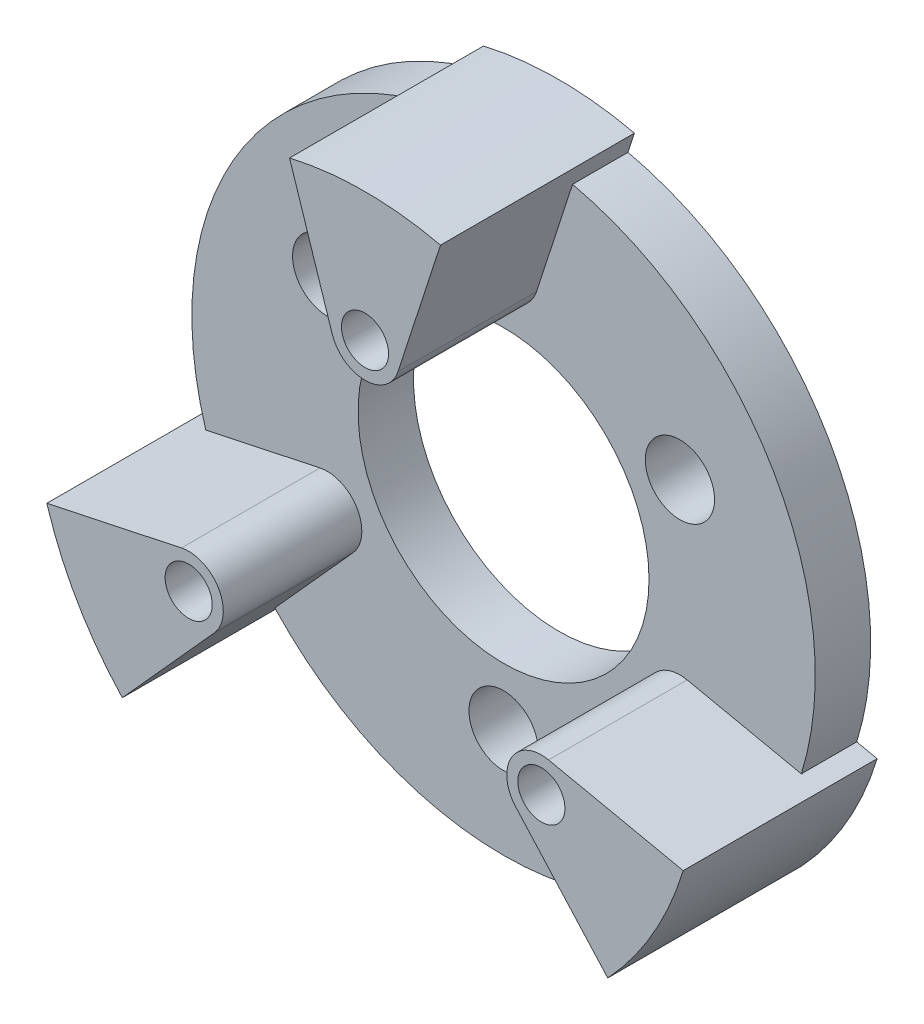
ISO-10303-21;
HEADER;
FILE_DESCRIPTION(('STEP AP214'),'2;1');
FILE_NAME('part.step','',(''),(''),'','','');
FILE_SCHEMA(('AUTOMOTIVE_DESIGN { 1 0 10303 214 1 1 1 1 }'));
ENDSEC;
DATA;
#1=APPLICATION_CONTEXT('core data for automotive mechanical design processes');
#2=APPLICATION_PROTOCOL_DEFINITION('international standard','automotive_design',2000,#1);
#3=PRODUCT_CONTEXT('',#1,'mechanical');
#4=PRODUCT('Part','Part','',(#3));
#5=PRODUCT_RELATED_PRODUCT_CATEGORY('part','',(#4));
#6=PRODUCT_DEFINITION_FORMATION('','',#4);
#7=PRODUCT_DEFINITION_CONTEXT('part definition',#1,'design');
#8=PRODUCT_DEFINITION('design','',#6,#7);
#9=PRODUCT_DEFINITION_SHAPE('','',#8);
#10=(LENGTH_UNIT() NAMED_UNIT(*) SI_UNIT(.MILLI.,.METRE.));
#11=(NAMED_UNIT(*) PLANE_ANGLE_UNIT() SI_UNIT($,.RADIAN.));
#12=(NAMED_UNIT(*) SI_UNIT($,.STERADIAN.) SOLID_ANGLE_UNIT());
#13=UNCERTAINTY_MEASURE_WITH_UNIT(LENGTH_MEASURE(1.E-05),#10,'distance_accuracy_value','');
#14=(GEOMETRIC_REPRESENTATION_CONTEXT(3) GLOBAL_UNCERTAINTY_ASSIGNED_CONTEXT((#13)) GLOBAL_UNIT_ASSIGNED_CONTEXT((#10,
#11,#12)) REPRESENTATION_CONTEXT('',''));
#15=CARTESIAN_POINT('',(0.,0.,0.));
#16=DIRECTION('',(0.,0.,1.));
#17=DIRECTION('',(1.,0.,0.));
#18=AXIS2_PLACEMENT_3D('',#15,#16,#17);
#19=CARTESIAN_POINT('',(0.,0.,14.));
#20=DIRECTION('',(0.,0.,1.));
#21=DIRECTION('',(1.,0.,0.));
#22=AXIS2_PLACEMENT_3D('',#19,#20,#21);
#23=PLANE('',#22);
#24=DIRECTION('',(-0.978147600733803,-0.20791169081777,0.));
#25=VECTOR('',#24,1.);
#26=CARTESIAN_POINT('',(0.424669986096791,-1.99791520318265,14.));
#27=LINE('',#26,#25);
#28=CARTESIAN_POINT('',(-13.2503526626756,-4.90463099816555,14.));
#29=VERTEX_POINT('',#28);
#30=CARTESIAN_POINT('',(-22.9657003966474,-6.96969190792735,14.));
#31=VERTEX_POINT('',#30);
#32=EDGE_CURVE('E216',#29,#31,#27,.T.);
#33=ORIENTED_EDGE('',*,*,#32,.T.);
#34=CARTESIAN_POINT('',(0.,0.,14.));
#35=DIRECTION('',(0.,0.,1.));
#36=DIRECTION('',(1.,0.,0.));
#37=AXIS2_PLACEMENT_3D('',#34,#35,#36);
#38=CIRCLE('',#37,24.);
#39=CARTESIAN_POINT('',(-17.5187804471395,-16.4040340052355,14.));
#40=VERTEX_POINT('',#39);
#41=EDGE_CURVE('E220',#31,#40,#38,.T.);
#42=ORIENTED_EDGE('',*,*,#41,.T.);
#43=DIRECTION('',(-0.669130606358859,-0.743144825477394,0.));
#44=VECTOR('',#43,1.);
#45=CARTESIAN_POINT('',(-1.51791032751495,1.36673259777592,14.));
#46=LINE('',#45,#44);
#47=CARTESIAN_POINT('',(-10.8727113719377,-9.02282651589721,14.));
#48=VERTEX_POINT('',#47);
#49=EDGE_CURVE('E225',#48,#40,#46,.T.);
#50=ORIENTED_EDGE('',*,*,#49,.F.);
#51=CARTESIAN_POINT('',(-12.7305734356312,-7.35000000000006,14.));
#52=DIRECTION('',(0.,0.,1.));
#53=DIRECTION('',(1.,0.,0.));
#54=AXIS2_PLACEMENT_3D('',#51,#52,#53);
#55=CIRCLE('',#54,2.5);
#56=EDGE_CURVE('E229',#48,#29,#55,.T.);
#57=ORIENTED_EDGE('',*,*,#56,.T.);
#58=EDGE_LOOP('',(#33,#42,#50,#57));
#59=FACE_BOUND('',#58,.T.);
#60=CARTESIAN_POINT('',(-12.7305734356312,-7.35000000000006,14.));
#61=DIRECTION('',(0.,0.,-1.));
#62=DIRECTION('',(-1.,0.,0.));
#63=AXIS2_PLACEMENT_3D('',#60,#61,#62);
#64=CIRCLE('',#63,1.7);
#65=CARTESIAN_POINT('',(-14.4305734356312,-7.35000000000006,14.));
#66=VERTEX_POINT('',#65);
#67=EDGE_CURVE('E506',#66,#66,#64,.T.);
#68=ORIENTED_EDGE('',*,*,#67,.T.);
#69=EDGE_LOOP('',(#68));
#70=FACE_BOUND('',#69,.T.);
#71=ADVANCED_FACE('F43',(#59,#70),#23,.T.);
#72=CARTESIAN_POINT('',(0.,0.,14.));
#73=DIRECTION('',(0.,0.,1.));
#74=DIRECTION('',(1.,0.,0.));
#75=AXIS2_PLACEMENT_3D('',#72,#73,#74);
#76=PLANE('',#75);
#77=DIRECTION('',(0.30901699437493,0.951056516295159,0.));
#78=VECTOR('',#77,1.);
#79=CARTESIAN_POINT('',(-1.94258031361156,0.631182605406652,14.));
#80=LINE('',#79,#78);
#81=CARTESIAN_POINT('',(2.37764129073789,13.9274575140627,14.));
#82=VERTEX_POINT('',#81);
#83=CARTESIAN_POINT('',(5.44691994950779,23.3737259131627,14.));
#84=VERTEX_POINT('',#83);
#85=EDGE_CURVE('E250',#82,#84,#80,.T.);
#86=ORIENTED_EDGE('',*,*,#85,.T.);
#87=CARTESIAN_POINT('',(0.,0.,14.));
#88=DIRECTION('',(0.,0.,1.));
#89=DIRECTION('',(1.,0.,0.));
#90=AXIS2_PLACEMENT_3D('',#87,#88,#89);
#91=CIRCLE('',#90,24.);
#92=CARTESIAN_POINT('',(-5.44691994950804,23.3737259131627,14.));
#93=VERTEX_POINT('',#92);
#94=EDGE_CURVE('E254',#84,#93,#91,.T.);
#95=ORIENTED_EDGE('',*,*,#94,.T.);
#96=DIRECTION('',(-0.309016994374954,0.951056516295151,0.));
#97=VECTOR('',#96,1.);
#98=CARTESIAN_POINT('',(1.94258031361188,0.631182605406812,14.));
#99=LINE('',#98,#97);
#100=CARTESIAN_POINT('',(-2.37764129073789,13.9274575140626,14.));
#101=VERTEX_POINT('',#100);
#102=EDGE_CURVE('E259',#101,#93,#99,.T.);
#103=ORIENTED_EDGE('',*,*,#102,.F.);
#104=CARTESIAN_POINT('',(0.,14.7,14.));
#105=DIRECTION('',(0.,0.,1.));
#106=DIRECTION('',(1.,0.,0.));
#107=AXIS2_PLACEMENT_3D('',#104,#105,#106);
#108=CIRCLE('',#107,2.5);
#109=EDGE_CURVE('E263',#101,#82,#108,.T.);
#110=ORIENTED_EDGE('',*,*,#109,.T.);
#111=EDGE_LOOP('',(#86,#95,#103,#110));
#112=FACE_BOUND('',#111,.T.);
#113=CARTESIAN_POINT('',(0.,14.7,14.));
#114=DIRECTION('',(0.,0.,-1.));
#115=DIRECTION('',(-1.,0.,0.));
#116=AXIS2_PLACEMENT_3D('',#113,#114,#115);
#117=CIRCLE('',#116,1.7);
#118=CARTESIAN_POINT('',(-1.7,14.7,14.));
#119=VERTEX_POINT('',#118);
#120=EDGE_CURVE('E520',#119,#119,#117,.T.);
#121=ORIENTED_EDGE('',*,*,#120,.T.);
#122=EDGE_LOOP('',(#121));
#123=FACE_BOUND('',#122,.T.);
#124=ADVANCED_FACE('F426',(#112,#123),#76,.T.);
#125=CARTESIAN_POINT('',(0.,0.,14.));
#126=DIRECTION('',(0.,0.,1.));
#127=DIRECTION('',(1.,0.,0.));
#128=AXIS2_PLACEMENT_3D('',#125,#126,#127);
#129=PLANE('',#128);
#130=DIRECTION('',(0.978147600733808,-0.207911690817746,0.));
#131=VECTOR('',#130,1.);
#132=CARTESIAN_POINT('',(-0.424669986096812,-1.99791520318299,14.));
#133=LINE('',#132,#131);
#134=CARTESIAN_POINT('',(13.2503526626756,-4.90463099816555,14.));
#135=VERTEX_POINT('',#134);
#136=CARTESIAN_POINT('',(22.9657003966475,-6.96969190792711,14.));
#137=VERTEX_POINT('',#136);
#138=EDGE_CURVE('E177',#135,#137,#133,.T.);
#139=ORIENTED_EDGE('',*,*,#138,.F.);
#140=CARTESIAN_POINT('',(12.7305734356312,-7.35000000000006,14.));
#141=DIRECTION('',(0.,0.,1.));
#142=DIRECTION('',(1.,0.,0.));
#143=AXIS2_PLACEMENT_3D('',#140,#141,#142);
#144=CIRCLE('',#143,2.5);
#145=CARTESIAN_POINT('',(10.8727113719377,-9.0228265158972,14.));
#146=VERTEX_POINT('',#145);
#147=EDGE_CURVE('E186',#135,#146,#144,.T.);
#148=ORIENTED_EDGE('',*,*,#147,.T.);
#149=DIRECTION('',(0.669130606358877,-0.743144825477377,0.));
#150=VECTOR('',#149,1.);
#151=CARTESIAN_POINT('',(1.51791032751466,1.36673259777573,14.));
#152=LINE('',#151,#150);
#153=CARTESIAN_POINT('',(17.5187804471396,-16.4040340052354,14.));
#154=VERTEX_POINT('',#153);
#155=EDGE_CURVE('E191',#146,#154,#152,.T.);
#156=ORIENTED_EDGE('',*,*,#155,.T.);
#157=CARTESIAN_POINT('',(0.,0.,14.));
#158=DIRECTION('',(0.,0.,1.));
#159=DIRECTION('',(1.,0.,0.));
#160=AXIS2_PLACEMENT_3D('',#157,#158,#159);
#161=CIRCLE('',#160,24.);
#162=EDGE_CURVE('E197',#154,#137,#161,.T.);
#163=ORIENTED_EDGE('',*,*,#162,.T.);
#164=EDGE_LOOP('',(#139,#148,#156,#163));
#165=FACE_BOUND('',#164,.T.);
#166=CARTESIAN_POINT('',(12.7305734356312,-7.35000000000006,14.));
#167=DIRECTION('',(0.,0.,-1.));
#168=DIRECTION('',(-1.,0.,0.));
#169=AXIS2_PLACEMENT_3D('',#166,#167,#168);
#170=CIRCLE('',#169,1.7);
#171=CARTESIAN_POINT('',(11.0305734356312,-7.35000000000006,14.));
#172=VERTEX_POINT('',#171);
#173=EDGE_CURVE('E532',#172,#172,#170,.T.);
#174=ORIENTED_EDGE('',*,*,#173,.T.);
#175=EDGE_LOOP('',(#174));
#176=FACE_BOUND('',#175,.T.);
#177=ADVANCED_FACE('F194',(#165,#176),#129,.T.);
#178=CARTESIAN_POINT('',(0.,0.,4.));
#179=DIRECTION('',(0.,0.,1.));
#180=DIRECTION('',(1.,0.,0.));
#181=AXIS2_PLACEMENT_3D('',#178,#179,#180);
#182=PLANE('',#181);
#183=CARTESIAN_POINT('',(0.,-14.7,4.));
#184=DIRECTION('',(0.,0.,1.));
#185=DIRECTION('',(1.,0.,0.));
#186=AXIS2_PLACEMENT_3D('',#183,#184,#185);
#187=CIRCLE('',#186,2.5);
#188=CARTESIAN_POINT('',(2.5,-14.7,4.));
#189=VERTEX_POINT('',#188);
#190=EDGE_CURVE('E203',#189,#189,#187,.T.);
#191=ORIENTED_EDGE('',*,*,#190,.F.);
#192=EDGE_LOOP('',(#191));
#193=FACE_BOUND('',#192,.T.);
#194=CARTESIAN_POINT('',(-12.7305734356312,7.35000000000006,4.));
#195=DIRECTION('',(0.,0.,1.));
#196=DIRECTION('',(1.,0.,0.));
#197=AXIS2_PLACEMENT_3D('',#194,#195,#196);
#198=CIRCLE('',#197,2.5);
#199=CARTESIAN_POINT('',(-10.2305734356312,7.35000000000006,4.));
#200=VERTEX_POINT('',#199);
#201=EDGE_CURVE('E551',#200,#200,#198,.T.);
#202=ORIENTED_EDGE('',*,*,#201,.F.);
#203=EDGE_LOOP('',(#202));
#204=FACE_BOUND('',#203,.T.);
#205=CARTESIAN_POINT('',(12.7305734356313,7.34999999999988,4.));
#206=DIRECTION('',(0.,0.,1.));
#207=DIRECTION('',(1.,0.,0.));
#208=AXIS2_PLACEMENT_3D('',#205,#206,#207);
#209=CIRCLE('',#208,2.5);
#210=CARTESIAN_POINT('',(15.2305734356313,7.34999999999988,4.));
#211=VERTEX_POINT('',#210);
#212=EDGE_CURVE('E541',#211,#211,#209,.T.);
#213=ORIENTED_EDGE('',*,*,#212,.F.);
#214=EDGE_LOOP('',(#213));
#215=FACE_BOUND('',#214,.T.);
#216=DIRECTION('',(0.978147600733808,-0.207911690817746,0.));
#217=VECTOR('',#216,1.);
#218=CARTESIAN_POINT('',(-0.424669986096812,-1.99791520318299,4.));
#219=LINE('',#218,#217);
#220=CARTESIAN_POINT('',(13.2503526626756,-4.90463099816555,4.));
#221=VERTEX_POINT('',#220);
#222=CARTESIAN_POINT('',(21.4927780589352,-6.65661260021603,4.));
#223=VERTEX_POINT('',#222);
#224=EDGE_CURVE('E178',#221,#223,#219,.T.);
#225=ORIENTED_EDGE('',*,*,#224,.T.);
#226=CARTESIAN_POINT('',(0.,0.,4.));
#227=DIRECTION('',(0.,0.,1.));
#228=DIRECTION('',(1.,0.,0.));
#229=AXIS2_PLACEMENT_3D('',#226,#227,#228);
#230=CIRCLE('',#229,22.5);
#231=CARTESIAN_POINT('',(4.98159341452872,21.9415980970467,4.));
#232=VERTEX_POINT('',#231);
#233=EDGE_CURVE('E53',#223,#232,#230,.T.);
#234=ORIENTED_EDGE('',*,*,#233,.T.);
#235=DIRECTION('',(0.30901699437493,0.951056516295159,0.));
#236=VECTOR('',#235,1.);
#237=CARTESIAN_POINT('',(-1.94258031361156,0.631182605406652,4.));
#238=LINE('',#237,#236);
#239=CARTESIAN_POINT('',(2.37764129073789,13.9274575140627,4.));
#240=VERTEX_POINT('',#239);
#241=EDGE_CURVE('E249',#240,#232,#238,.T.);
#242=ORIENTED_EDGE('',*,*,#241,.F.);
#243=CARTESIAN_POINT('',(0.,14.7,4.));
#244=DIRECTION('',(0.,0.,1.));
#245=DIRECTION('',(1.,0.,0.));
#246=AXIS2_PLACEMENT_3D('',#243,#244,#245);
#247=CIRCLE('',#246,2.5);
#248=CARTESIAN_POINT('',(-2.37764129073789,13.9274575140626,4.));
#249=VERTEX_POINT('',#248);
#250=EDGE_CURVE('E255',#249,#240,#247,.T.);
#251=ORIENTED_EDGE('',*,*,#250,.F.);
#252=DIRECTION('',(-0.309016994374954,0.951056516295151,0.));
#253=VECTOR('',#252,1.);
#254=CARTESIAN_POINT('',(1.94258031361188,0.631182605406812,4.));
#255=LINE('',#254,#253);
#256=CARTESIAN_POINT('',(-4.98159341452892,21.9415980970467,4.));
#257=VERTEX_POINT('',#256);
#258=EDGE_CURVE('E270',#249,#257,#255,.T.);
#259=ORIENTED_EDGE('',*,*,#258,.T.);
#260=CARTESIAN_POINT('',(-21.4927780589351,-6.65661260021624,4.));
#261=VERTEX_POINT('',#260);
#262=EDGE_CURVE('E55',#257,#261,#230,.T.);
#263=ORIENTED_EDGE('',*,*,#262,.T.);
#264=DIRECTION('',(-0.978147600733803,-0.20791169081777,0.));
#265=VECTOR('',#264,1.);
#266=CARTESIAN_POINT('',(0.424669986096791,-1.99791520318265,4.));
#267=LINE('',#266,#265);
#268=CARTESIAN_POINT('',(-13.2503526626756,-4.90463099816556,4.));
#269=VERTEX_POINT('',#268);
#270=EDGE_CURVE('E181',#269,#261,#267,.T.);
#271=ORIENTED_EDGE('',*,*,#270,.F.);
#272=CARTESIAN_POINT('',(-12.7305734356312,-7.35000000000006,4.));
#273=DIRECTION('',(0.,0.,1.));
#274=DIRECTION('',(1.,0.,0.));
#275=AXIS2_PLACEMENT_3D('',#272,#273,#274);
#276=CIRCLE('',#275,2.5);
#277=CARTESIAN_POINT('',(-10.8727113719377,-9.02282651589721,4.));
#278=VERTEX_POINT('',#277);
#279=EDGE_CURVE('E221',#278,#269,#276,.T.);
#280=ORIENTED_EDGE('',*,*,#279,.F.);
#281=DIRECTION('',(-0.669130606358859,-0.743144825477394,0.));
#282=VECTOR('',#281,1.);
#283=CARTESIAN_POINT('',(-1.51791032751495,1.36673259777592,4.));
#284=LINE('',#283,#282);
#285=CARTESIAN_POINT('',(-16.5111846444062,-15.2849854968307,4.));
#286=VERTEX_POINT('',#285);
#287=EDGE_CURVE('E236',#278,#286,#284,.T.);
#288=ORIENTED_EDGE('',*,*,#287,.T.);
#289=CARTESIAN_POINT('',(16.5111846444064,-15.2849854968305,4.));
#290=VERTEX_POINT('',#289);
#291=EDGE_CURVE('E11',#286,#290,#230,.T.);
#292=ORIENTED_EDGE('',*,*,#291,.T.);
#293=DIRECTION('',(0.669130606358877,-0.743144825477377,0.));
#294=VECTOR('',#293,1.);
#295=CARTESIAN_POINT('',(1.51791032751466,1.36673259777573,4.));
#296=LINE('',#295,#294);
#297=CARTESIAN_POINT('',(10.8727113719377,-9.0228265158972,4.));
#298=VERTEX_POINT('',#297);
#299=EDGE_CURVE('E66',#298,#290,#296,.T.);
#300=ORIENTED_EDGE('',*,*,#299,.F.);
#301=CARTESIAN_POINT('',(12.7305734356312,-7.35000000000006,4.));
#302=DIRECTION('',(0.,0.,1.));
#303=DIRECTION('',(1.,0.,0.));
#304=AXIS2_PLACEMENT_3D('',#301,#302,#303);
#305=CIRCLE('',#304,2.5);
#306=EDGE_CURVE('E62',#221,#298,#305,.T.);
#307=ORIENTED_EDGE('',*,*,#306,.F.);
#308=EDGE_LOOP('',(#225,#234,#242,#251,#259,#263,#271,#280,#288,#292,#300,#307));
#309=FACE_BOUND('',#308,.T.);
#310=CARTESIAN_POINT('',(0.,0.,4.));
#311=DIRECTION('',(0.,0.,1.));
#312=DIRECTION('',(1.,0.,0.));
#313=AXIS2_PLACEMENT_3D('',#310,#311,#312);
#314=CIRCLE('',#313,10.5);
#315=CARTESIAN_POINT('',(10.5,0.,4.));
#316=VERTEX_POINT('',#315);
#317=EDGE_CURVE('E356',#316,#316,#314,.T.);
#318=ORIENTED_EDGE('',*,*,#317,.F.);
#319=EDGE_LOOP('',(#318));
#320=FACE_BOUND('',#319,.T.);
#321=ADVANCED_FACE('F393',(#193,#204,#215,#309,#320),#182,.T.);
#322=CARTESIAN_POINT('',(0.,0.,4.));
#323=DIRECTION('',(0.,0.,-1.));
#324=DIRECTION('',(-1.,0.,0.));
#325=AXIS2_PLACEMENT_3D('',#322,#323,#324);
#326=CYLINDRICAL_SURFACE('',#325,22.5);
#327=ORIENTED_EDGE('',*,*,#233,.F.);
#328=DIRECTION('',(0.,0.,-1.));
#329=VECTOR('',#328,1.);
#330=CARTESIAN_POINT('',(21.4927780589352,-6.65661260021603,4.));
#331=LINE('',#330,#329);
#332=CARTESIAN_POINT('',(21.4927780589352,-6.65661260021603,0.));
#333=VERTEX_POINT('',#332);
#334=EDGE_CURVE('E303',#223,#333,#331,.T.);
#335=ORIENTED_EDGE('',*,*,#334,.T.);
#336=CARTESIAN_POINT('',(0.,0.,0.));
#337=DIRECTION('',(0.,0.,1.));
#338=DIRECTION('',(1.,0.,0.));
#339=AXIS2_PLACEMENT_3D('',#336,#337,#338);
#340=CIRCLE('',#339,22.5);
#341=CARTESIAN_POINT('',(4.98159341452872,21.9415980970467,0.));
#342=VERTEX_POINT('',#341);
#343=EDGE_CURVE('E365',#333,#342,#340,.T.);
#344=ORIENTED_EDGE('',*,*,#343,.T.);
#345=DIRECTION('',(0.,0.,-1.));
#346=VECTOR('',#345,1.);
#347=CARTESIAN_POINT('',(4.98159341452872,21.9415980970467,4.));
#348=LINE('',#347,#346);
#349=EDGE_CURVE('E311',#342,#232,#348,.F.);
#350=ORIENTED_EDGE('',*,*,#349,.T.);
#351=EDGE_LOOP('',(#327,#335,#344,#350));
#352=FACE_BOUND('',#351,.T.);
#353=ADVANCED_FACE('F388',(#352),#326,.T.);
#354=ORIENTED_EDGE('',*,*,#262,.F.);
#355=DIRECTION('',(0.,0.,-1.));
#356=VECTOR('',#355,1.);
#357=CARTESIAN_POINT('',(-4.98159341452892,21.9415980970467,4.));
#358=LINE('',#357,#356);
#359=CARTESIAN_POINT('',(-4.98159341452892,21.9415980970467,0.));
#360=VERTEX_POINT('',#359);
#361=EDGE_CURVE('E327',#257,#360,#358,.T.);
#362=ORIENTED_EDGE('',*,*,#361,.T.);
#363=CARTESIAN_POINT('',(-21.4927780589351,-6.65661260021624,0.));
#364=VERTEX_POINT('',#363);
#365=EDGE_CURVE('E361',#360,#364,#340,.T.);
#366=ORIENTED_EDGE('',*,*,#365,.T.);
#367=DIRECTION('',(0.,0.,-1.));
#368=VECTOR('',#367,1.);
#369=CARTESIAN_POINT('',(-21.4927780589351,-6.65661260021623,4.));
#370=LINE('',#369,#368);
#371=EDGE_CURVE('E335',#364,#261,#370,.F.);
#372=ORIENTED_EDGE('',*,*,#371,.T.);
#373=EDGE_LOOP('',(#354,#362,#366,#372));
#374=FACE_BOUND('',#373,.T.);
#375=ADVANCED_FACE('F396',(#374),#326,.T.);
#376=CARTESIAN_POINT('',(0.,0.,4.));
#377=DIRECTION('',(0.,0.,-1.));
#378=DIRECTION('',(-1.,0.,0.));
#379=AXIS2_PLACEMENT_3D('',#376,#377,#378);
#380=CYLINDRICAL_SURFACE('',#379,10.5);
#381=ORIENTED_EDGE('',*,*,#317,.T.);
#382=EDGE_LOOP('',(#381));
#383=FACE_BOUND('',#382,.T.);
#384=CARTESIAN_POINT('',(0.,0.,0.));
#385=DIRECTION('',(0.,0.,1.));
#386=DIRECTION('',(1.,0.,0.));
#387=AXIS2_PLACEMENT_3D('',#384,#385,#386);
#388=CIRCLE('',#387,10.5);
#389=CARTESIAN_POINT('',(10.5,0.,0.));
#390=VERTEX_POINT('',#389);
#391=EDGE_CURVE('E355',#390,#390,#388,.T.);
#392=ORIENTED_EDGE('',*,*,#391,.F.);
#393=EDGE_LOOP('',(#392));
#394=FACE_BOUND('',#393,.T.);
#395=ADVANCED_FACE('F45',(#383,#394),#380,.F.);
#396=CARTESIAN_POINT('',(-16.5111846444062,-15.2849854968307,0.));
#397=VERTEX_POINT('',#396);
#398=CARTESIAN_POINT('',(16.5111846444064,-15.2849854968305,0.));
#399=VERTEX_POINT('',#398);
#400=EDGE_CURVE('E47',#397,#399,#340,.T.);
#401=ORIENTED_EDGE('',*,*,#400,.T.);
#402=DIRECTION('',(0.,0.,-1.));
#403=VECTOR('',#402,1.);
#404=CARTESIAN_POINT('',(16.5111846444064,-15.2849854968305,4.));
#405=LINE('',#404,#403);
#406=EDGE_CURVE('E288',#399,#290,#405,.F.);
#407=ORIENTED_EDGE('',*,*,#406,.T.);
#408=ORIENTED_EDGE('',*,*,#291,.F.);
#409=DIRECTION('',(0.,0.,-1.));
#410=VECTOR('',#409,1.);
#411=CARTESIAN_POINT('',(-16.5111846444062,-15.2849854968307,4.));
#412=LINE('',#411,#410);
#413=EDGE_CURVE('E351',#286,#397,#412,.T.);
#414=ORIENTED_EDGE('',*,*,#413,.T.);
#415=EDGE_LOOP('',(#401,#407,#408,#414));
#416=FACE_BOUND('',#415,.T.);
#417=ADVANCED_FACE('F372',(#416),#326,.T.);
#418=CARTESIAN_POINT('',(0.,0.,0.));
#419=DIRECTION('',(0.,0.,1.));
#420=DIRECTION('',(1.,0.,0.));
#421=AXIS2_PLACEMENT_3D('',#418,#419,#420);
#422=PLANE('',#421);
#423=CARTESIAN_POINT('',(-12.7305734356312,-7.35000000000006,0.));
#424=DIRECTION('',(0.,0.,-1.));
#425=DIRECTION('',(-1.,0.,0.));
#426=AXIS2_PLACEMENT_3D('',#423,#424,#425);
#427=CIRCLE('',#426,3.15);
#428=CARTESIAN_POINT('',(-15.8805734356312,-7.35000000000006,0.));
#429=VERTEX_POINT('',#428);
#430=EDGE_CURVE('E501',#429,#429,#427,.T.);
#431=ORIENTED_EDGE('',*,*,#430,.F.);
#432=EDGE_LOOP('',(#431));
#433=FACE_BOUND('',#432,.T.);
#434=CARTESIAN_POINT('',(0.,14.7,0.));
#435=DIRECTION('',(0.,0.,-1.));
#436=DIRECTION('',(-1.,0.,0.));
#437=AXIS2_PLACEMENT_3D('',#434,#435,#436);
#438=CIRCLE('',#437,3.15);
#439=CARTESIAN_POINT('',(-3.15,14.7,0.));
#440=VERTEX_POINT('',#439);
#441=EDGE_CURVE('E512',#440,#440,#438,.T.);
#442=ORIENTED_EDGE('',*,*,#441,.F.);
#443=EDGE_LOOP('',(#442));
#444=FACE_BOUND('',#443,.T.);
#445=CARTESIAN_POINT('',(12.7305734356312,-7.35000000000006,0.));
#446=DIRECTION('',(0.,0.,-1.));
#447=DIRECTION('',(-1.,0.,0.));
#448=AXIS2_PLACEMENT_3D('',#445,#446,#447);
#449=CIRCLE('',#448,3.15);
#450=CARTESIAN_POINT('',(9.58057343563122,-7.35000000000006,0.));
#451=VERTEX_POINT('',#450);
#452=EDGE_CURVE('E524',#451,#451,#449,.T.);
#453=ORIENTED_EDGE('',*,*,#452,.F.);
#454=EDGE_LOOP('',(#453));
#455=FACE_BOUND('',#454,.T.);
#456=CARTESIAN_POINT('',(0.,-14.7,0.));
#457=DIRECTION('',(0.,0.,1.));
#458=DIRECTION('',(1.,0.,0.));
#459=AXIS2_PLACEMENT_3D('',#456,#457,#458);
#460=CIRCLE('',#459,2.5);
#461=CARTESIAN_POINT('',(2.5,-14.7,0.));
#462=VERTEX_POINT('',#461);
#463=EDGE_CURVE('E537',#462,#462,#460,.T.);
#464=ORIENTED_EDGE('',*,*,#463,.T.);
#465=EDGE_LOOP('',(#464));
#466=FACE_BOUND('',#465,.T.);
#467=CARTESIAN_POINT('',(-12.7305734356312,7.35000000000006,0.));
#468=DIRECTION('',(0.,0.,1.));
#469=DIRECTION('',(1.,0.,0.));
#470=AXIS2_PLACEMENT_3D('',#467,#468,#469);
#471=CIRCLE('',#470,2.5);
#472=CARTESIAN_POINT('',(-10.2305734356312,7.35000000000006,0.));
#473=VERTEX_POINT('',#472);
#474=EDGE_CURVE('E542',#473,#473,#471,.T.);
#475=ORIENTED_EDGE('',*,*,#474,.T.);
#476=EDGE_LOOP('',(#475));
#477=FACE_BOUND('',#476,.T.);
#478=CARTESIAN_POINT('',(12.7305734356313,7.34999999999988,0.));
#479=DIRECTION('',(0.,0.,1.));
#480=DIRECTION('',(1.,0.,0.));
#481=AXIS2_PLACEMENT_3D('',#478,#479,#480);
#482=CIRCLE('',#481,2.5);
#483=CARTESIAN_POINT('',(15.2305734356313,7.34999999999988,0.));
#484=VERTEX_POINT('',#483);
#485=EDGE_CURVE('E536',#484,#484,#482,.T.);
#486=ORIENTED_EDGE('',*,*,#485,.T.);
#487=EDGE_LOOP('',(#486));
#488=FACE_BOUND('',#487,.T.);
#489=ORIENTED_EDGE('',*,*,#391,.T.);
#490=EDGE_LOOP('',(#489));
#491=FACE_BOUND('',#490,.T.);
#492=ORIENTED_EDGE('',*,*,#343,.F.);
#493=DIRECTION('',(0.978147600733809,-0.207911690817746,0.));
#494=VECTOR('',#493,1.);
#495=CARTESIAN_POINT('',(13.2503526626756,-4.90463099816555,0.));
#496=LINE('',#495,#494);
#497=CARTESIAN_POINT('',(22.9657003966475,-6.96969190792711,0.));
#498=VERTEX_POINT('',#497);
#499=EDGE_CURVE('E285',#333,#498,#496,.T.);
#500=ORIENTED_EDGE('',*,*,#499,.T.);
#501=CARTESIAN_POINT('',(0.,0.,0.));
#502=DIRECTION('',(0.,0.,1.));
#503=DIRECTION('',(1.,0.,0.));
#504=AXIS2_PLACEMENT_3D('',#501,#502,#503);
#505=CIRCLE('',#504,24.);
#506=CARTESIAN_POINT('',(17.5187804471397,-16.4040340052354,0.));
#507=VERTEX_POINT('',#506);
#508=EDGE_CURVE('E289',#498,#507,#505,.F.);
#509=ORIENTED_EDGE('',*,*,#508,.T.);
#510=DIRECTION('',(-0.669130606358877,0.743144825477377,0.));
#511=VECTOR('',#510,1.);
#512=CARTESIAN_POINT('',(10.8727113719377,-9.0228265158972,0.));
#513=LINE('',#512,#511);
#514=EDGE_CURVE('E290',#507,#399,#513,.T.);
#515=ORIENTED_EDGE('',*,*,#514,.T.);
#516=ORIENTED_EDGE('',*,*,#400,.F.);
#517=DIRECTION('',(-0.669130606358859,-0.743144825477394,0.));
#518=VECTOR('',#517,1.);
#519=CARTESIAN_POINT('',(-10.8727113719377,-9.02282651589721,0.));
#520=LINE('',#519,#518);
#521=CARTESIAN_POINT('',(-17.5187804471395,-16.4040340052355,0.));
#522=VERTEX_POINT('',#521);
#523=EDGE_CURVE('E332',#397,#522,#520,.T.);
#524=ORIENTED_EDGE('',*,*,#523,.T.);
#525=CARTESIAN_POINT('',(0.,0.,0.));
#526=DIRECTION('',(0.,0.,1.));
#527=DIRECTION('',(1.,0.,0.));
#528=AXIS2_PLACEMENT_3D('',#525,#526,#527);
#529=CIRCLE('',#528,24.);
#530=CARTESIAN_POINT('',(-22.9657003966474,-6.96969190792735,0.));
#531=VERTEX_POINT('',#530);
#532=EDGE_CURVE('E336',#522,#531,#529,.F.);
#533=ORIENTED_EDGE('',*,*,#532,.T.);
#534=DIRECTION('',(0.978147600733803,0.20791169081777,0.));
#535=VECTOR('',#534,1.);
#536=CARTESIAN_POINT('',(-13.2503526626756,-4.90463099816556,0.));
#537=LINE('',#536,#535);
#538=EDGE_CURVE('E337',#531,#364,#537,.T.);
#539=ORIENTED_EDGE('',*,*,#538,.T.);
#540=ORIENTED_EDGE('',*,*,#365,.F.);
#541=DIRECTION('',(-0.309016994374954,0.951056516295151,0.));
#542=VECTOR('',#541,1.);
#543=CARTESIAN_POINT('',(-2.37764129073789,13.9274575140626,0.));
#544=LINE('',#543,#542);
#545=CARTESIAN_POINT('',(-5.44691994950804,23.3737259131627,0.));
#546=VERTEX_POINT('',#545);
#547=EDGE_CURVE('E308',#360,#546,#544,.T.);
#548=ORIENTED_EDGE('',*,*,#547,.T.);
#549=CARTESIAN_POINT('',(0.,0.,0.));
#550=DIRECTION('',(0.,0.,1.));
#551=DIRECTION('',(1.,0.,0.));
#552=AXIS2_PLACEMENT_3D('',#549,#550,#551);
#553=CIRCLE('',#552,24.);
#554=CARTESIAN_POINT('',(5.44691994950779,23.3737259131627,0.));
#555=VERTEX_POINT('',#554);
#556=EDGE_CURVE('E312',#546,#555,#553,.F.);
#557=ORIENTED_EDGE('',*,*,#556,.T.);
#558=DIRECTION('',(-0.30901699437493,-0.951056516295159,0.));
#559=VECTOR('',#558,1.);
#560=CARTESIAN_POINT('',(2.37764129073789,13.9274575140627,0.));
#561=LINE('',#560,#559);
#562=EDGE_CURVE('E313',#555,#342,#561,.T.);
#563=ORIENTED_EDGE('',*,*,#562,.T.);
#564=EDGE_LOOP('',(#492,#500,#509,#515,#516,#524,#533,#539,#540,#548,#557,#563));
#565=FACE_BOUND('',#564,.T.);
#566=ADVANCED_FACE('F381',(#433,#444,#455,#466,#477,#488,#491,#565),#422,.F.);
#567=CARTESIAN_POINT('',(-10.8727113719377,-9.02282651589721,-17.1953237976881));
#568=DIRECTION('',(0.743144825477394,-0.669130606358859,0.));
#569=DIRECTION('',(0.669130606358859,0.743144825477394,0.));
#570=AXIS2_PLACEMENT_3D('',#567,#568,#569);
#571=PLANE('',#570);
#572=ORIENTED_EDGE('',*,*,#413,.F.);
#573=ORIENTED_EDGE('',*,*,#287,.F.);
#574=DIRECTION('',(0.,0.,-1.));
#575=VECTOR('',#574,1.);
#576=CARTESIAN_POINT('',(-10.8727113719377,-9.02282651589721,14.));
#577=LINE('',#576,#575);
#578=EDGE_CURVE('E245',#48,#278,#577,.T.);
#579=ORIENTED_EDGE('',*,*,#578,.F.);
#580=ORIENTED_EDGE('',*,*,#49,.T.);
#581=DIRECTION('',(0.,0.,1.));
#582=VECTOR('',#581,1.);
#583=CARTESIAN_POINT('',(-17.5187804471395,-16.4040340052355,-17.1953237976881));
#584=LINE('',#583,#582);
#585=EDGE_CURVE('E331',#522,#40,#584,.T.);
#586=ORIENTED_EDGE('',*,*,#585,.F.);
#587=ORIENTED_EDGE('',*,*,#523,.F.);
#588=EDGE_LOOP('',(#572,#573,#579,#580,#586,#587));
#589=FACE_BOUND('',#588,.T.);
#590=ADVANCED_FACE('F408',(#589),#571,.T.);
#591=CARTESIAN_POINT('',(-13.2503526626756,-4.90463099816556,-17.1953237976881));
#592=DIRECTION('',(-0.20791169081777,0.978147600733803,0.));
#593=DIRECTION('',(-0.978147600733803,-0.20791169081777,0.));
#594=AXIS2_PLACEMENT_3D('',#591,#592,#593);
#595=PLANE('',#594);
#596=ORIENTED_EDGE('',*,*,#371,.F.);
#597=ORIENTED_EDGE('',*,*,#538,.F.);
#598=DIRECTION('',(0.,0.,1.));
#599=VECTOR('',#598,1.);
#600=CARTESIAN_POINT('',(-22.9657003966474,-6.96969190792735,-17.1953237976881));
#601=LINE('',#600,#599);
#602=EDGE_CURVE('E341',#531,#31,#601,.T.);
#603=ORIENTED_EDGE('',*,*,#602,.T.);
#604=ORIENTED_EDGE('',*,*,#32,.F.);
#605=DIRECTION('',(0.,0.,-1.));
#606=VECTOR('',#605,1.);
#607=CARTESIAN_POINT('',(-13.2503526626756,-4.90463099816555,14.));
#608=LINE('',#607,#606);
#609=EDGE_CURVE('E232',#29,#269,#608,.T.);
#610=ORIENTED_EDGE('',*,*,#609,.T.);
#611=ORIENTED_EDGE('',*,*,#270,.T.);
#612=EDGE_LOOP('',(#596,#597,#603,#604,#610,#611));
#613=FACE_BOUND('',#612,.T.);
#614=ADVANCED_FACE('F399',(#613),#595,.T.);
#615=CARTESIAN_POINT('',(0.,0.,-17.1953237976881));
#616=DIRECTION('',(0.,0.,1.));
#617=DIRECTION('',(1.,0.,0.));
#618=AXIS2_PLACEMENT_3D('',#615,#616,#617);
#619=CYLINDRICAL_SURFACE('',#618,24.);
#620=ORIENTED_EDGE('',*,*,#532,.F.);
#621=ORIENTED_EDGE('',*,*,#585,.T.);
#622=ORIENTED_EDGE('',*,*,#41,.F.);
#623=ORIENTED_EDGE('',*,*,#602,.F.);
#624=EDGE_LOOP('',(#620,#621,#622,#623));
#625=FACE_BOUND('',#624,.T.);
#626=ADVANCED_FACE('F413',(#625),#619,.T.);
#627=CARTESIAN_POINT('',(-2.37764129073789,13.9274575140626,-17.1953237976881));
#628=DIRECTION('',(-0.951056516295151,-0.309016994374954,0.));
#629=DIRECTION('',(0.309016994374954,-0.951056516295151,0.));
#630=AXIS2_PLACEMENT_3D('',#627,#628,#629);
#631=PLANE('',#630);
#632=ORIENTED_EDGE('',*,*,#361,.F.);
#633=ORIENTED_EDGE('',*,*,#258,.F.);
#634=DIRECTION('',(0.,0.,-1.));
#635=VECTOR('',#634,1.);
#636=CARTESIAN_POINT('',(-2.37764129073789,13.9274575140626,14.));
#637=LINE('',#636,#635);
#638=EDGE_CURVE('E280',#101,#249,#637,.T.);
#639=ORIENTED_EDGE('',*,*,#638,.F.);
#640=ORIENTED_EDGE('',*,*,#102,.T.);
#641=DIRECTION('',(0.,0.,1.));
#642=VECTOR('',#641,1.);
#643=CARTESIAN_POINT('',(-5.44691994950804,23.3737259131627,-17.1953237976881));
#644=LINE('',#643,#642);
#645=EDGE_CURVE('E307',#546,#93,#644,.T.);
#646=ORIENTED_EDGE('',*,*,#645,.F.);
#647=ORIENTED_EDGE('',*,*,#547,.F.);
#648=EDGE_LOOP('',(#632,#633,#639,#640,#646,#647));
#649=FACE_BOUND('',#648,.T.);
#650=ADVANCED_FACE('F419',(#649),#631,.T.);
#651=CARTESIAN_POINT('',(2.37764129073789,13.9274575140627,-17.1953237976881));
#652=DIRECTION('',(0.951056516295159,-0.30901699437493,0.));
#653=DIRECTION('',(0.30901699437493,0.951056516295159,0.));
#654=AXIS2_PLACEMENT_3D('',#651,#652,#653);
#655=PLANE('',#654);
#656=ORIENTED_EDGE('',*,*,#349,.F.);
#657=ORIENTED_EDGE('',*,*,#562,.F.);
#658=DIRECTION('',(0.,0.,1.));
#659=VECTOR('',#658,1.);
#660=CARTESIAN_POINT('',(5.44691994950779,23.3737259131627,-17.1953237976881));
#661=LINE('',#660,#659);
#662=EDGE_CURVE('E317',#555,#84,#661,.T.);
#663=ORIENTED_EDGE('',*,*,#662,.T.);
#664=ORIENTED_EDGE('',*,*,#85,.F.);
#665=DIRECTION('',(0.,0.,-1.));
#666=VECTOR('',#665,1.);
#667=CARTESIAN_POINT('',(2.37764129073789,13.9274575140627,14.));
#668=LINE('',#667,#666);
#669=EDGE_CURVE('E266',#82,#240,#668,.T.);
#670=ORIENTED_EDGE('',*,*,#669,.T.);
#671=ORIENTED_EDGE('',*,*,#241,.T.);
#672=EDGE_LOOP('',(#656,#657,#663,#664,#670,#671));
#673=FACE_BOUND('',#672,.T.);
#674=ADVANCED_FACE('F432',(#673),#655,.T.);
#675=CARTESIAN_POINT('',(0.,0.,-17.1953237976881));
#676=DIRECTION('',(0.,0.,1.));
#677=DIRECTION('',(1.,0.,0.));
#678=AXIS2_PLACEMENT_3D('',#675,#676,#677);
#679=CYLINDRICAL_SURFACE('',#678,24.);
#680=ORIENTED_EDGE('',*,*,#556,.F.);
#681=ORIENTED_EDGE('',*,*,#645,.T.);
#682=ORIENTED_EDGE('',*,*,#94,.F.);
#683=ORIENTED_EDGE('',*,*,#662,.F.);
#684=EDGE_LOOP('',(#680,#681,#682,#683));
#685=FACE_BOUND('',#684,.T.);
#686=ADVANCED_FACE('F423',(#685),#679,.T.);
#687=CARTESIAN_POINT('',(13.2503526626756,-4.90463099816555,-17.1953237976881));
#688=DIRECTION('',(0.207911690817746,0.978147600733808,0.));
#689=DIRECTION('',(-0.978147600733809,0.207911690817746,0.));
#690=AXIS2_PLACEMENT_3D('',#687,#688,#689);
#691=PLANE('',#690);
#692=ORIENTED_EDGE('',*,*,#334,.F.);
#693=ORIENTED_EDGE('',*,*,#224,.F.);
#694=DIRECTION('',(0.,0.,-1.));
#695=VECTOR('',#694,1.);
#696=CARTESIAN_POINT('',(13.2503526626756,-4.90463099816555,14.));
#697=LINE('',#696,#695);
#698=EDGE_CURVE('E171',#135,#221,#697,.T.);
#699=ORIENTED_EDGE('',*,*,#698,.F.);
#700=ORIENTED_EDGE('',*,*,#138,.T.);
#701=DIRECTION('',(0.,0.,1.));
#702=VECTOR('',#701,1.);
#703=CARTESIAN_POINT('',(22.9657003966475,-6.96969190792711,-17.1953237976881));
#704=LINE('',#703,#702);
#705=EDGE_CURVE('E284',#498,#137,#704,.T.);
#706=ORIENTED_EDGE('',*,*,#705,.F.);
#707=ORIENTED_EDGE('',*,*,#499,.F.);
#708=EDGE_LOOP('',(#692,#693,#699,#700,#706,#707));
#709=FACE_BOUND('',#708,.T.);
#710=ADVANCED_FACE('F174',(#709),#691,.T.);
#711=CARTESIAN_POINT('',(10.8727113719377,-9.0228265158972,-17.1953237976881));
#712=DIRECTION('',(-0.743144825477377,-0.669130606358877,0.));
#713=DIRECTION('',(0.669130606358877,-0.743144825477377,0.));
#714=AXIS2_PLACEMENT_3D('',#711,#712,#713);
#715=PLANE('',#714);
#716=ORIENTED_EDGE('',*,*,#406,.F.);
#717=ORIENTED_EDGE('',*,*,#514,.F.);
#718=DIRECTION('',(0.,0.,1.));
#719=VECTOR('',#718,1.);
#720=CARTESIAN_POINT('',(17.5187804471396,-16.4040340052354,-17.1953237976881));
#721=LINE('',#720,#719);
#722=EDGE_CURVE('E294',#507,#154,#721,.T.);
#723=ORIENTED_EDGE('',*,*,#722,.T.);
#724=ORIENTED_EDGE('',*,*,#155,.F.);
#725=DIRECTION('',(0.,0.,-1.));
#726=VECTOR('',#725,1.);
#727=CARTESIAN_POINT('',(10.8727113719377,-9.0228265158972,14.));
#728=LINE('',#727,#726);
#729=EDGE_CURVE('E182',#146,#298,#728,.T.);
#730=ORIENTED_EDGE('',*,*,#729,.T.);
#731=ORIENTED_EDGE('',*,*,#299,.T.);
#732=EDGE_LOOP('',(#716,#717,#723,#724,#730,#731));
#733=FACE_BOUND('',#732,.T.);
#734=ADVANCED_FACE('F379',(#733),#715,.T.);
#735=CARTESIAN_POINT('',(0.,0.,-17.1953237976881));
#736=DIRECTION('',(0.,0.,1.));
#737=DIRECTION('',(1.,0.,0.));
#738=AXIS2_PLACEMENT_3D('',#735,#736,#737);
#739=CYLINDRICAL_SURFACE('',#738,24.);
#740=ORIENTED_EDGE('',*,*,#508,.F.);
#741=ORIENTED_EDGE('',*,*,#705,.T.);
#742=ORIENTED_EDGE('',*,*,#162,.F.);
#743=ORIENTED_EDGE('',*,*,#722,.F.);
#744=EDGE_LOOP('',(#740,#741,#742,#743));
#745=FACE_BOUND('',#744,.T.);
#746=ADVANCED_FACE('F385',(#745),#739,.T.);
#747=CARTESIAN_POINT('',(0.,14.7,14.));
#748=DIRECTION('',(0.,0.,-1.));
#749=DIRECTION('',(-1.,0.,0.));
#750=AXIS2_PLACEMENT_3D('',#747,#748,#749);
#751=CYLINDRICAL_SURFACE('',#750,2.5);
#752=ORIENTED_EDGE('',*,*,#250,.T.);
#753=ORIENTED_EDGE('',*,*,#669,.F.);
#754=ORIENTED_EDGE('',*,*,#109,.F.);
#755=ORIENTED_EDGE('',*,*,#638,.T.);
#756=EDGE_LOOP('',(#752,#753,#754,#755));
#757=FACE_BOUND('',#756,.T.);
#758=ADVANCED_FACE('F435',(#757),#751,.T.);
#759=CARTESIAN_POINT('',(-12.7305734356312,-7.35000000000006,14.));
#760=DIRECTION('',(0.,0.,-1.));
#761=DIRECTION('',(-1.,0.,0.));
#762=AXIS2_PLACEMENT_3D('',#759,#760,#761);
#763=CYLINDRICAL_SURFACE('',#762,2.5);
#764=ORIENTED_EDGE('',*,*,#279,.T.);
#765=ORIENTED_EDGE('',*,*,#609,.F.);
#766=ORIENTED_EDGE('',*,*,#56,.F.);
#767=ORIENTED_EDGE('',*,*,#578,.T.);
#768=EDGE_LOOP('',(#764,#765,#766,#767));
#769=FACE_BOUND('',#768,.T.);
#770=ADVANCED_FACE('F404',(#769),#763,.T.);
#771=CARTESIAN_POINT('',(12.7305734356312,-7.35000000000006,14.));
#772=DIRECTION('',(0.,0.,-1.));
#773=DIRECTION('',(-1.,0.,0.));
#774=AXIS2_PLACEMENT_3D('',#771,#772,#773);
#775=CYLINDRICAL_SURFACE('',#774,2.5);
#776=ORIENTED_EDGE('',*,*,#306,.T.);
#777=ORIENTED_EDGE('',*,*,#729,.F.);
#778=ORIENTED_EDGE('',*,*,#147,.F.);
#779=ORIENTED_EDGE('',*,*,#698,.T.);
#780=EDGE_LOOP('',(#776,#777,#778,#779));
#781=FACE_BOUND('',#780,.T.);
#782=ADVANCED_FACE('F187',(#781),#775,.T.);
#783=CARTESIAN_POINT('',(12.7305734356313,7.34999999999988,0.));
#784=DIRECTION('',(0.,0.,1.));
#785=DIRECTION('',(1.,0.,0.));
#786=AXIS2_PLACEMENT_3D('',#783,#784,#785);
#787=CYLINDRICAL_SURFACE('',#786,2.5);
#788=ORIENTED_EDGE('',*,*,#212,.T.);
#789=EDGE_LOOP('',(#788));
#790=FACE_BOUND('',#789,.T.);
#791=ORIENTED_EDGE('',*,*,#485,.F.);
#792=EDGE_LOOP('',(#791));
#793=FACE_BOUND('',#792,.T.);
#794=ADVANCED_FACE('F456',(#790,#793),#787,.F.);
#795=CARTESIAN_POINT('',(-12.7305734356312,7.35000000000006,0.));
#796=DIRECTION('',(0.,0.,1.));
#797=DIRECTION('',(1.,0.,0.));
#798=AXIS2_PLACEMENT_3D('',#795,#796,#797);
#799=CYLINDRICAL_SURFACE('',#798,2.5);
#800=ORIENTED_EDGE('',*,*,#201,.T.);
#801=EDGE_LOOP('',(#800));
#802=FACE_BOUND('',#801,.T.);
#803=ORIENTED_EDGE('',*,*,#474,.F.);
#804=EDGE_LOOP('',(#803));
#805=FACE_BOUND('',#804,.T.);
#806=ADVANCED_FACE('F461',(#802,#805),#799,.F.);
#807=CARTESIAN_POINT('',(0.,-14.7,0.));
#808=DIRECTION('',(0.,0.,1.));
#809=DIRECTION('',(1.,0.,0.));
#810=AXIS2_PLACEMENT_3D('',#807,#808,#809);
#811=CYLINDRICAL_SURFACE('',#810,2.5);
#812=ORIENTED_EDGE('',*,*,#190,.T.);
#813=EDGE_LOOP('',(#812));
#814=FACE_BOUND('',#813,.T.);
#815=ORIENTED_EDGE('',*,*,#463,.F.);
#816=EDGE_LOOP('',(#815));
#817=FACE_BOUND('',#816,.T.);
#818=ADVANCED_FACE('F465',(#814,#817),#811,.F.);
#819=CARTESIAN_POINT('',(12.7305734356312,-7.35000000000006,0.));
#820=DIRECTION('',(0.,0.,-1.));
#821=DIRECTION('',(-1.,0.,0.));
#822=AXIS2_PLACEMENT_3D('',#819,#820,#821);
#823=CYLINDRICAL_SURFACE('',#822,1.7);
#824=ORIENTED_EDGE('',*,*,#173,.F.);
#825=EDGE_LOOP('',(#824));
#826=FACE_BOUND('',#825,.T.);
#827=CARTESIAN_POINT('',(12.7305734356312,-7.35000000000006,1.45));
#828=DIRECTION('',(0.,0.,-1.));
#829=DIRECTION('',(-1.,0.,0.));
#830=AXIS2_PLACEMENT_3D('',#827,#828,#829);
#831=CIRCLE('',#830,1.7);
#832=CARTESIAN_POINT('',(11.0305734356312,-7.35000000000006,1.45));
#833=VERTEX_POINT('',#832);
#834=EDGE_CURVE('E528',#833,#833,#831,.T.);
#835=ORIENTED_EDGE('',*,*,#834,.T.);
#836=EDGE_LOOP('',(#835));
#837=FACE_BOUND('',#836,.T.);
#838=ADVANCED_FACE('F469',(#826,#837),#823,.F.);
#839=CARTESIAN_POINT('',(12.7305734356312,-7.35000000000006,0.));
#840=DIRECTION('',(0.,0.,-1.));
#841=DIRECTION('',(-1.,0.,0.));
#842=AXIS2_PLACEMENT_3D('',#839,#840,#841);
#843=CONICAL_SURFACE('',#842,3.15,0.785398163397447);
#844=ORIENTED_EDGE('',*,*,#834,.F.);
#845=EDGE_LOOP('',(#844));
#846=FACE_BOUND('',#845,.T.);
#847=ORIENTED_EDGE('',*,*,#452,.T.);
#848=EDGE_LOOP('',(#847));
#849=FACE_BOUND('',#848,.T.);
#850=ADVANCED_FACE('F473',(#846,#849),#843,.F.);
#851=CARTESIAN_POINT('',(0.,14.7,0.));
#852=DIRECTION('',(0.,0.,-1.));
#853=DIRECTION('',(-1.,0.,0.));
#854=AXIS2_PLACEMENT_3D('',#851,#852,#853);
#855=CYLINDRICAL_SURFACE('',#854,1.7);
#856=ORIENTED_EDGE('',*,*,#120,.F.);
#857=EDGE_LOOP('',(#856));
#858=FACE_BOUND('',#857,.T.);
#859=CARTESIAN_POINT('',(0.,14.7,1.45));
#860=DIRECTION('',(0.,0.,-1.));
#861=DIRECTION('',(-1.,0.,0.));
#862=AXIS2_PLACEMENT_3D('',#859,#860,#861);
#863=CIRCLE('',#862,1.7);
#864=CARTESIAN_POINT('',(-1.7,14.7,1.45));
#865=VERTEX_POINT('',#864);
#866=EDGE_CURVE('E516',#865,#865,#863,.T.);
#867=ORIENTED_EDGE('',*,*,#866,.T.);
#868=EDGE_LOOP('',(#867));
#869=FACE_BOUND('',#868,.T.);
#870=ADVANCED_FACE('F477',(#858,#869),#855,.F.);
#871=CARTESIAN_POINT('',(0.,14.7,0.));
#872=DIRECTION('',(0.,0.,-1.));
#873=DIRECTION('',(-1.,0.,0.));
#874=AXIS2_PLACEMENT_3D('',#871,#872,#873);
#875=CONICAL_SURFACE('',#874,3.15,0.785398163397448);
#876=ORIENTED_EDGE('',*,*,#866,.F.);
#877=EDGE_LOOP('',(#876));
#878=FACE_BOUND('',#877,.T.);
#879=ORIENTED_EDGE('',*,*,#441,.T.);
#880=EDGE_LOOP('',(#879));
#881=FACE_BOUND('',#880,.T.);
#882=ADVANCED_FACE('F481',(#878,#881),#875,.F.);
#883=CARTESIAN_POINT('',(-12.7305734356312,-7.35000000000006,0.));
#884=DIRECTION('',(0.,0.,-1.));
#885=DIRECTION('',(-1.,0.,0.));
#886=AXIS2_PLACEMENT_3D('',#883,#884,#885);
#887=CYLINDRICAL_SURFACE('',#886,1.7);
#888=ORIENTED_EDGE('',*,*,#67,.F.);
#889=EDGE_LOOP('',(#888));
#890=FACE_BOUND('',#889,.T.);
#891=CARTESIAN_POINT('',(-12.7305734356312,-7.35000000000006,1.45));
#892=DIRECTION('',(0.,0.,-1.));
#893=DIRECTION('',(-1.,0.,0.));
#894=AXIS2_PLACEMENT_3D('',#891,#892,#893);
#895=CIRCLE('',#894,1.7);
#896=CARTESIAN_POINT('',(-14.4305734356312,-7.35000000000006,1.45));
#897=VERTEX_POINT('',#896);
#898=EDGE_CURVE('E498',#897,#897,#895,.T.);
#899=ORIENTED_EDGE('',*,*,#898,.T.);
#900=EDGE_LOOP('',(#899));
#901=FACE_BOUND('',#900,.T.);
#902=ADVANCED_FACE('F485',(#890,#901),#887,.F.);
#903=CARTESIAN_POINT('',(-12.7305734356312,-7.35000000000006,0.));
#904=DIRECTION('',(0.,0.,-1.));
#905=DIRECTION('',(-1.,0.,0.));
#906=AXIS2_PLACEMENT_3D('',#903,#904,#905);
#907=CONICAL_SURFACE('',#906,3.15,0.785398163397448);
#908=ORIENTED_EDGE('',*,*,#898,.F.);
#909=EDGE_LOOP('',(#908));
#910=FACE_BOUND('',#909,.T.);
#911=ORIENTED_EDGE('',*,*,#430,.T.);
#912=EDGE_LOOP('',(#911));
#913=FACE_BOUND('',#912,.T.);
#914=ADVANCED_FACE('F489',(#910,#913),#907,.F.);
#915=CLOSED_SHELL('',(#71,#124,#177,#321,#353,#375,#395,#417,#566,#590,#614,#626,#650,#674,#686,
#710,#734,#746,#758,#770,#782,#794,#806,#818,#838,#850,#870,#882,#902,#914));
#916=MANIFOLD_SOLID_BREP('B2',#915);
#917=ADVANCED_BREP_SHAPE_REPRESENTATION('',(#18,#916),#14);
#918=SHAPE_DEFINITION_REPRESENTATION(#9,#917);
ENDSEC;
END-ISO-10303-21;
